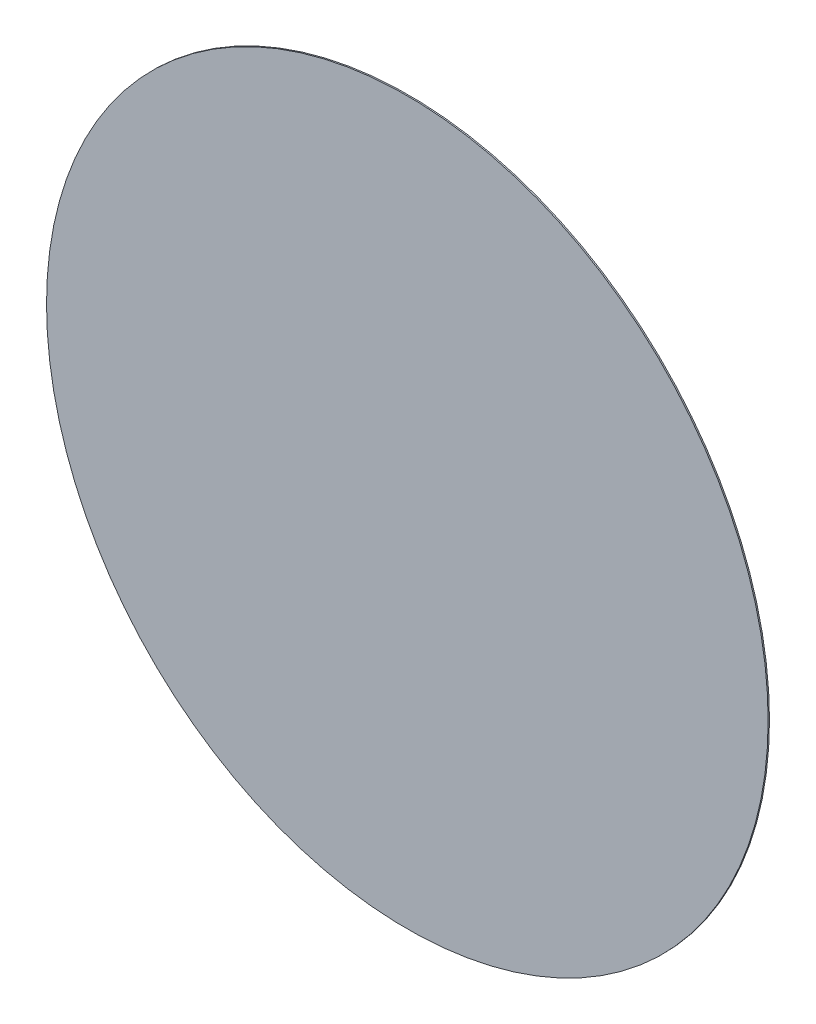
ISO-10303-21;
HEADER;
FILE_DESCRIPTION(('STEP AP214'),'2;1');
FILE_NAME('part.step','',(''),(''),'','','');
FILE_SCHEMA(('AUTOMOTIVE_DESIGN { 1 0 10303 214 1 1 1 1 }'));
ENDSEC;
DATA;
#1=APPLICATION_CONTEXT('core data for automotive mechanical design processes');
#2=APPLICATION_PROTOCOL_DEFINITION('international standard','automotive_design',2000,#1);
#3=PRODUCT_CONTEXT('',#1,'mechanical');
#4=PRODUCT('Part','Part','',(#3));
#5=PRODUCT_RELATED_PRODUCT_CATEGORY('part','',(#4));
#6=PRODUCT_DEFINITION_FORMATION('','',#4);
#7=PRODUCT_DEFINITION_CONTEXT('part definition',#1,'design');
#8=PRODUCT_DEFINITION('design','',#6,#7);
#9=PRODUCT_DEFINITION_SHAPE('','',#8);
#10=(LENGTH_UNIT() NAMED_UNIT(*) SI_UNIT(.MILLI.,.METRE.));
#11=(NAMED_UNIT(*) PLANE_ANGLE_UNIT() SI_UNIT($,.RADIAN.));
#12=(NAMED_UNIT(*) SI_UNIT($,.STERADIAN.) SOLID_ANGLE_UNIT());
#13=UNCERTAINTY_MEASURE_WITH_UNIT(LENGTH_MEASURE(1.E-05),#10,'distance_accuracy_value','');
#14=(GEOMETRIC_REPRESENTATION_CONTEXT(3) GLOBAL_UNCERTAINTY_ASSIGNED_CONTEXT((#13)) GLOBAL_UNIT_ASSIGNED_CONTEXT((#10,
#11,#12)) REPRESENTATION_CONTEXT('',''));
#15=CARTESIAN_POINT('',(0.,0.,0.));
#16=DIRECTION('',(0.,0.,1.));
#17=DIRECTION('',(1.,0.,0.));
#18=AXIS2_PLACEMENT_3D('',#15,#16,#17);
#19=CARTESIAN_POINT('',(2.69999968,0.,0.00999998));
#20=DIRECTION('',(0.,0.,-1.));
#21=DIRECTION('',(-1.,0.,0.));
#22=AXIS2_PLACEMENT_3D('',#19,#20,#21);
#23=PLANE('',#22);
#24=CARTESIAN_POINT('',(0.,0.,0.00999998));
#25=DIRECTION('',(0.,0.,-1.));
#26=DIRECTION('',(-1.,0.,0.));
#27=AXIS2_PLACEMENT_3D('',#24,#25,#26);
#28=CIRCLE('',#27,2.69999968);
#29=CARTESIAN_POINT('',(-2.69999968,0.,0.00999998));
#30=VERTEX_POINT('',#29);
#31=EDGE_CURVE('E17',#30,#30,#28,.T.);
#32=ORIENTED_EDGE('',*,*,#31,.F.);
#33=EDGE_LOOP('',(#32));
#34=FACE_BOUND('',#33,.T.);
#35=ADVANCED_FACE('F14',(#34),#23,.F.);
#36=CARTESIAN_POINT('',(0.,0.,0.));
#37=DIRECTION('',(0.,0.,-1.));
#38=DIRECTION('',(-1.,0.,0.));
#39=AXIS2_PLACEMENT_3D('',#36,#37,#38);
#40=CYLINDRICAL_SURFACE('',#39,2.69999968);
#41=ORIENTED_EDGE('',*,*,#31,.T.);
#42=EDGE_LOOP('',(#41));
#43=FACE_BOUND('',#42,.T.);
#44=CARTESIAN_POINT('',(0.,0.,0.));
#45=DIRECTION('',(0.,0.,-1.));
#46=DIRECTION('',(-1.,0.,0.));
#47=AXIS2_PLACEMENT_3D('',#44,#45,#46);
#48=CIRCLE('',#47,2.69999968);
#49=CARTESIAN_POINT('',(-2.69999968,0.,0.));
#50=VERTEX_POINT('',#49);
#51=EDGE_CURVE('E10',#50,#50,#48,.T.);
#52=ORIENTED_EDGE('',*,*,#51,.F.);
#53=EDGE_LOOP('',(#52));
#54=FACE_BOUND('',#53,.T.);
#55=ADVANCED_FACE('F26',(#43,#54),#40,.T.);
#56=CARTESIAN_POINT('',(2.69999968,0.,0.));
#57=DIRECTION('',(0.,0.,-1.));
#58=DIRECTION('',(-1.,0.,0.));
#59=AXIS2_PLACEMENT_3D('',#56,#57,#58);
#60=PLANE('',#59);
#61=ORIENTED_EDGE('',*,*,#51,.T.);
#62=EDGE_LOOP('',(#61));
#63=FACE_BOUND('',#62,.T.);
#64=ADVANCED_FACE('F34',(#63),#60,.T.);
#65=CLOSED_SHELL('',(#35,#55,#64));
#66=MANIFOLD_SOLID_BREP('B1',#65);
#67=ADVANCED_BREP_SHAPE_REPRESENTATION('',(#18,#66),#14);
#68=SHAPE_DEFINITION_REPRESENTATION(#9,#67);
ENDSEC;
END-ISO-10303-21;
